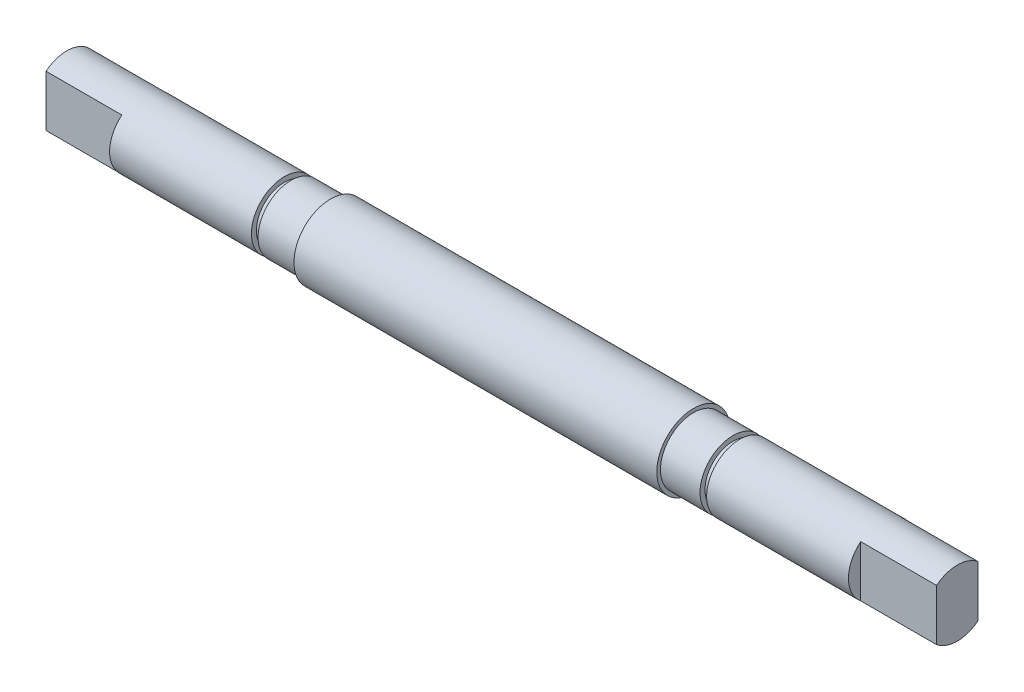
ISO-10303-21;
HEADER;
FILE_DESCRIPTION(('STEP AP214'),'2;1');
FILE_NAME('part.step','',(''),(''),'','','');
FILE_SCHEMA(('AUTOMOTIVE_DESIGN { 1 0 10303 214 1 1 1 1 }'));
ENDSEC;
DATA;
#1=APPLICATION_CONTEXT('core data for automotive mechanical design processes');
#2=APPLICATION_PROTOCOL_DEFINITION('international standard','automotive_design',2000,#1);
#3=PRODUCT_CONTEXT('',#1,'mechanical');
#4=PRODUCT('Part','Part','',(#3));
#5=PRODUCT_RELATED_PRODUCT_CATEGORY('part','',(#4));
#6=PRODUCT_DEFINITION_FORMATION('','',#4);
#7=PRODUCT_DEFINITION_CONTEXT('part definition',#1,'design');
#8=PRODUCT_DEFINITION('design','',#6,#7);
#9=PRODUCT_DEFINITION_SHAPE('','',#8);
#10=(LENGTH_UNIT() NAMED_UNIT(*) SI_UNIT(.MILLI.,.METRE.));
#11=(NAMED_UNIT(*) PLANE_ANGLE_UNIT() SI_UNIT($,.RADIAN.));
#12=(NAMED_UNIT(*) SI_UNIT($,.STERADIAN.) SOLID_ANGLE_UNIT());
#13=UNCERTAINTY_MEASURE_WITH_UNIT(LENGTH_MEASURE(1.E-05),#10,'distance_accuracy_value','');
#14=(GEOMETRIC_REPRESENTATION_CONTEXT(3) GLOBAL_UNCERTAINTY_ASSIGNED_CONTEXT((#13)) GLOBAL_UNIT_ASSIGNED_CONTEXT((#10,
#11,#12)) REPRESENTATION_CONTEXT('',''));
#15=CARTESIAN_POINT('',(0.,0.,0.));
#16=DIRECTION('',(0.,0.,1.));
#17=DIRECTION('',(1.,0.,0.));
#18=AXIS2_PLACEMENT_3D('',#15,#16,#17);
#19=CARTESIAN_POINT('',(203.505191192069,10.,0.));
#20=DIRECTION('',(1.,0.,0.));
#21=DIRECTION('',(0.,0.,1.));
#22=AXIS2_PLACEMENT_3D('',#19,#20,#21);
#23=PLANE('',#22);
#24=CARTESIAN_POINT('',(203.505191192069,0.,0.));
#25=DIRECTION('',(1.,0.,0.));
#26=DIRECTION('',(0.,0.,-1.));
#27=AXIS2_PLACEMENT_3D('',#24,#25,#26);
#28=CIRCLE('',#27,10.);
#29=CARTESIAN_POINT('',(203.505191192069,7.78345250416509,-6.27836500335925));
#30=VERTEX_POINT('',#29);
#31=CARTESIAN_POINT('',(203.505191192069,7.7834525041651,6.27836500335925));
#32=VERTEX_POINT('',#31);
#33=EDGE_CURVE('E142',#30,#32,#28,.T.);
#34=ORIENTED_EDGE('',*,*,#33,.T.);
#35=DIRECTION('',(0.,-1.,0.));
#36=VECTOR('',#35,1.);
#37=CARTESIAN_POINT('',(203.505191192069,-7.78345250416509,6.27836500335925));
#38=LINE('',#37,#36);
#39=CARTESIAN_POINT('',(203.505191192069,-7.78345250416509,6.27836500335925));
#40=VERTEX_POINT('',#39);
#41=EDGE_CURVE('E106',#32,#40,#38,.T.);
#42=ORIENTED_EDGE('',*,*,#41,.T.);
#43=CARTESIAN_POINT('',(203.505191192069,-7.7834525041651,-6.27836500335925));
#44=VERTEX_POINT('',#43);
#45=EDGE_CURVE('E111',#40,#44,#28,.T.);
#46=ORIENTED_EDGE('',*,*,#45,.T.);
#47=DIRECTION('',(0.,1.,0.));
#48=VECTOR('',#47,1.);
#49=CARTESIAN_POINT('',(203.505191192069,-7.7834525041651,-6.27836500335925));
#50=LINE('',#49,#48);
#51=EDGE_CURVE('E121',#44,#30,#50,.T.);
#52=ORIENTED_EDGE('',*,*,#51,.T.);
#53=EDGE_LOOP('',(#34,#42,#46,#52));
#54=FACE_BOUND('',#53,.T.);
#55=ADVANCED_FACE('F32',(#54),#23,.T.);
#56=CARTESIAN_POINT('',(66.5954170694878,0.,0.));
#57=DIRECTION('',(-1.,0.,0.));
#58=DIRECTION('',(0.,0.,-1.));
#59=AXIS2_PLACEMENT_3D('',#56,#57,#58);
#60=CYLINDRICAL_SURFACE('',#59,10.);
#61=CARTESIAN_POINT('',(137.505191192069,0.,0.));
#62=DIRECTION('',(1.,0.,0.));
#63=DIRECTION('',(0.,0.,-1.));
#64=AXIS2_PLACEMENT_3D('',#61,#62,#63);
#65=CIRCLE('',#64,10.);
#66=CARTESIAN_POINT('',(137.505191192069,0.,-10.));
#67=VERTEX_POINT('',#66);
#68=EDGE_CURVE('E139',#67,#67,#65,.T.);
#69=ORIENTED_EDGE('',*,*,#68,.T.);
#70=EDGE_LOOP('',(#69));
#71=FACE_BOUND('',#70,.T.);
#72=CARTESIAN_POINT('',(180.505191192069,0.,0.));
#73=DIRECTION('',(-1.,0.,0.));
#74=DIRECTION('',(0.,0.,1.));
#75=AXIS2_PLACEMENT_3D('',#72,#73,#74);
#76=CIRCLE('',#75,10.);
#77=CARTESIAN_POINT('',(180.505191192069,-7.78345250416509,6.27836500335925));
#78=VERTEX_POINT('',#77);
#79=CARTESIAN_POINT('',(180.505191192069,7.78345250416509,6.27836500335924));
#80=VERTEX_POINT('',#79);
#81=EDGE_CURVE('E102',#78,#80,#76,.T.);
#82=ORIENTED_EDGE('',*,*,#81,.T.);
#83=DIRECTION('',(1.,0.,0.));
#84=VECTOR('',#83,1.);
#85=CARTESIAN_POINT('',(180.505191192069,7.7834525041651,6.27836500335925));
#86=LINE('',#85,#84);
#87=EDGE_CURVE('E47',#80,#32,#86,.T.);
#88=ORIENTED_EDGE('',*,*,#87,.T.);
#89=ORIENTED_EDGE('',*,*,#33,.F.);
#90=DIRECTION('',(1.,0.,0.));
#91=VECTOR('',#90,1.);
#92=CARTESIAN_POINT('',(180.505191192069,7.78345250416509,-6.27836500335925));
#93=LINE('',#92,#91);
#94=CARTESIAN_POINT('',(180.505191192069,7.78345250416509,-6.27836500335925));
#95=VERTEX_POINT('',#94);
#96=EDGE_CURVE('E123',#95,#30,#93,.T.);
#97=ORIENTED_EDGE('',*,*,#96,.F.);
#98=CARTESIAN_POINT('',(180.505191192069,0.,0.));
#99=DIRECTION('',(-1.,0.,0.));
#100=DIRECTION('',(0.,0.,1.));
#101=AXIS2_PLACEMENT_3D('',#98,#99,#100);
#102=CIRCLE('',#101,10.);
#103=CARTESIAN_POINT('',(180.505191192069,-7.7834525041651,-6.27836500335925));
#104=VERTEX_POINT('',#103);
#105=EDGE_CURVE('E117',#95,#104,#102,.T.);
#106=ORIENTED_EDGE('',*,*,#105,.T.);
#107=DIRECTION('',(1.,0.,0.));
#108=VECTOR('',#107,1.);
#109=CARTESIAN_POINT('',(180.505191192069,-7.7834525041651,-6.27836500335925));
#110=LINE('',#109,#108);
#111=EDGE_CURVE('E55',#104,#44,#110,.T.);
#112=ORIENTED_EDGE('',*,*,#111,.T.);
#113=ORIENTED_EDGE('',*,*,#45,.F.);
#114=DIRECTION('',(1.,0.,0.));
#115=VECTOR('',#114,1.);
#116=CARTESIAN_POINT('',(180.505191192069,-7.78345250416509,6.27836500335925));
#117=LINE('',#116,#115);
#118=EDGE_CURVE('E98',#78,#40,#117,.T.);
#119=ORIENTED_EDGE('',*,*,#118,.F.);
#120=EDGE_LOOP('',(#82,#88,#89,#97,#106,#112,#113,#119));
#121=FACE_BOUND('',#120,.T.);
#122=ADVANCED_FACE('F109',(#71,#121),#60,.T.);
#123=CARTESIAN_POINT('',(13.5051911920693,11.1125,0.));
#124=DIRECTION('',(-1.,0.,0.));
#125=DIRECTION('',(0.,0.,1.));
#126=AXIS2_PLACEMENT_3D('',#123,#124,#125);
#127=PLANE('',#126);
#128=CARTESIAN_POINT('',(13.5051911920693,0.,0.));
#129=DIRECTION('',(1.,0.,0.));
#130=DIRECTION('',(0.,0.,-1.));
#131=AXIS2_PLACEMENT_3D('',#128,#129,#130);
#132=CIRCLE('',#131,10.);
#133=CARTESIAN_POINT('',(13.5051911920693,0.,-10.));
#134=VERTEX_POINT('',#133);
#135=EDGE_CURVE('E169',#134,#134,#132,.T.);
#136=ORIENTED_EDGE('',*,*,#135,.T.);
#137=EDGE_LOOP('',(#136));
#138=FACE_BOUND('',#137,.T.);
#139=CARTESIAN_POINT('',(13.5051911920693,0.,0.));
#140=DIRECTION('',(1.,0.,0.));
#141=DIRECTION('',(0.,0.,-1.));
#142=AXIS2_PLACEMENT_3D('',#139,#140,#141);
#143=CIRCLE('',#142,11.1125);
#144=CARTESIAN_POINT('',(13.5051911920693,0.,-11.1125));
#145=VERTEX_POINT('',#144);
#146=EDGE_CURVE('E11',#145,#145,#143,.T.);
#147=ORIENTED_EDGE('',*,*,#146,.F.);
#148=EDGE_LOOP('',(#147));
#149=FACE_BOUND('',#148,.T.);
#150=ADVANCED_FACE('F34',(#138,#149),#127,.T.);
#151=CARTESIAN_POINT('',(70.4149653146509,0.,0.));
#152=DIRECTION('',(1.,0.,0.));
#153=DIRECTION('',(0.,0.,-1.));
#154=AXIS2_PLACEMENT_3D('',#151,#152,#153);
#155=CYLINDRICAL_SURFACE('',#154,11.1125);
#156=ORIENTED_EDGE('',*,*,#146,.T.);
#157=EDGE_LOOP('',(#156));
#158=FACE_BOUND('',#157,.T.);
#159=CARTESIAN_POINT('',(123.505191192069,0.,0.));
#160=DIRECTION('',(1.,0.,0.));
#161=DIRECTION('',(0.,0.,-1.));
#162=AXIS2_PLACEMENT_3D('',#159,#160,#161);
#163=CIRCLE('',#162,11.1125);
#164=CARTESIAN_POINT('',(123.505191192069,0.,-11.1125));
#165=VERTEX_POINT('',#164);
#166=EDGE_CURVE('E145',#165,#165,#163,.T.);
#167=ORIENTED_EDGE('',*,*,#166,.F.);
#168=EDGE_LOOP('',(#167));
#169=FACE_BOUND('',#168,.T.);
#170=ADVANCED_FACE('F296',(#158,#169),#155,.T.);
#171=CARTESIAN_POINT('',(-66.4948088079307,10.,0.));
#172=DIRECTION('',(-1.,0.,0.));
#173=DIRECTION('',(0.,0.,1.));
#174=AXIS2_PLACEMENT_3D('',#171,#172,#173);
#175=PLANE('',#174);
#176=DIRECTION('',(0.,1.,0.));
#177=VECTOR('',#176,1.);
#178=CARTESIAN_POINT('',(-66.4948088079307,-7.7834525041651,-6.27836500335925));
#179=LINE('',#178,#177);
#180=CARTESIAN_POINT('',(-66.4948088079307,-7.7834525041651,-6.27836500335925));
#181=VERTEX_POINT('',#180);
#182=CARTESIAN_POINT('',(-66.4948088079307,7.78345250416509,-6.27836500335925));
#183=VERTEX_POINT('',#182);
#184=EDGE_CURVE('E148',#181,#183,#179,.T.);
#185=ORIENTED_EDGE('',*,*,#184,.F.);
#186=CARTESIAN_POINT('',(-66.4948088079307,0.,0.));
#187=DIRECTION('',(1.,0.,0.));
#188=DIRECTION('',(0.,0.,-1.));
#189=AXIS2_PLACEMENT_3D('',#186,#187,#188);
#190=CIRCLE('',#189,10.);
#191=CARTESIAN_POINT('',(-66.4948088079307,-7.78345250416509,6.27836500335925));
#192=VERTEX_POINT('',#191);
#193=EDGE_CURVE('E40',#192,#181,#190,.T.);
#194=ORIENTED_EDGE('',*,*,#193,.F.);
#195=DIRECTION('',(0.,-1.,0.));
#196=VECTOR('',#195,1.);
#197=CARTESIAN_POINT('',(-66.4948088079307,-7.78345250416509,6.27836500335925));
#198=LINE('',#197,#196);
#199=CARTESIAN_POINT('',(-66.4948088079307,7.7834525041651,6.27836500335925));
#200=VERTEX_POINT('',#199);
#201=EDGE_CURVE('E158',#200,#192,#198,.T.);
#202=ORIENTED_EDGE('',*,*,#201,.F.);
#203=EDGE_CURVE('E185',#183,#200,#190,.T.);
#204=ORIENTED_EDGE('',*,*,#203,.F.);
#205=EDGE_LOOP('',(#185,#194,#202,#204));
#206=FACE_BOUND('',#205,.T.);
#207=ADVANCED_FACE('F204',(#206),#175,.T.);
#208=CARTESIAN_POINT('',(70.4149653146509,0.,0.));
#209=DIRECTION('',(1.,0.,0.));
#210=DIRECTION('',(0.,0.,-1.));
#211=AXIS2_PLACEMENT_3D('',#208,#209,#210);
#212=CYLINDRICAL_SURFACE('',#211,10.);
#213=DIRECTION('',(-1.,0.,0.));
#214=VECTOR('',#213,1.);
#215=CARTESIAN_POINT('',(-43.4948088079307,-7.7834525041651,-6.27836500335925));
#216=LINE('',#215,#214);
#217=CARTESIAN_POINT('',(-43.4948088079307,-7.7834525041651,-6.27836500335925));
#218=VERTEX_POINT('',#217);
#219=EDGE_CURVE('E153',#218,#181,#216,.T.);
#220=ORIENTED_EDGE('',*,*,#219,.F.);
#221=CARTESIAN_POINT('',(-43.4948088079307,0.,0.));
#222=DIRECTION('',(-1.,0.,0.));
#223=DIRECTION('',(0.,0.,1.));
#224=AXIS2_PLACEMENT_3D('',#221,#222,#223);
#225=CIRCLE('',#224,10.);
#226=CARTESIAN_POINT('',(-43.4948088079307,7.78345250416509,-6.27836500335924));
#227=VERTEX_POINT('',#226);
#228=EDGE_CURVE('E149',#227,#218,#225,.T.);
#229=ORIENTED_EDGE('',*,*,#228,.F.);
#230=DIRECTION('',(-1.,0.,0.));
#231=VECTOR('',#230,1.);
#232=CARTESIAN_POINT('',(-43.4948088079307,7.78345250416509,-6.27836500335925));
#233=LINE('',#232,#231);
#234=EDGE_CURVE('E155',#227,#183,#233,.T.);
#235=ORIENTED_EDGE('',*,*,#234,.T.);
#236=ORIENTED_EDGE('',*,*,#203,.T.);
#237=DIRECTION('',(-1.,0.,0.));
#238=VECTOR('',#237,1.);
#239=CARTESIAN_POINT('',(-43.4948088079307,7.7834525041651,6.27836500335925));
#240=LINE('',#239,#238);
#241=CARTESIAN_POINT('',(-43.4948088079307,7.7834525041651,6.27836500335925));
#242=VERTEX_POINT('',#241);
#243=EDGE_CURVE('E164',#242,#200,#240,.T.);
#244=ORIENTED_EDGE('',*,*,#243,.F.);
#245=CARTESIAN_POINT('',(-43.4948088079307,0.,0.));
#246=DIRECTION('',(-1.,0.,0.));
#247=DIRECTION('',(0.,0.,1.));
#248=AXIS2_PLACEMENT_3D('',#245,#246,#247);
#249=CIRCLE('',#248,10.);
#250=CARTESIAN_POINT('',(-43.4948088079307,-7.7834525041651,6.27836500335925));
#251=VERTEX_POINT('',#250);
#252=EDGE_CURVE('E160',#251,#242,#249,.T.);
#253=ORIENTED_EDGE('',*,*,#252,.F.);
#254=DIRECTION('',(-1.,0.,0.));
#255=VECTOR('',#254,1.);
#256=CARTESIAN_POINT('',(-43.4948088079307,-7.78345250416509,6.27836500335925));
#257=LINE('',#256,#255);
#258=EDGE_CURVE('E166',#251,#192,#257,.T.);
#259=ORIENTED_EDGE('',*,*,#258,.T.);
#260=ORIENTED_EDGE('',*,*,#193,.T.);
#261=EDGE_LOOP('',(#220,#229,#235,#236,#244,#253,#259,#260));
#262=FACE_BOUND('',#261,.T.);
#263=CARTESIAN_POINT('',(-0.49480880793068,0.,0.));
#264=DIRECTION('',(1.,0.,0.));
#265=DIRECTION('',(0.,0.,-1.));
#266=AXIS2_PLACEMENT_3D('',#263,#264,#265);
#267=CIRCLE('',#266,10.);
#268=CARTESIAN_POINT('',(-0.49480880793068,0.,-10.));
#269=VERTEX_POINT('',#268);
#270=EDGE_CURVE('E183',#269,#269,#267,.T.);
#271=ORIENTED_EDGE('',*,*,#270,.F.);
#272=EDGE_LOOP('',(#271));
#273=FACE_BOUND('',#272,.T.);
#274=ADVANCED_FACE('F192',(#262,#273),#212,.T.);
#275=CARTESIAN_POINT('',(-0.494808807930674,10.,0.));
#276=DIRECTION('',(1.,0.,0.));
#277=DIRECTION('',(0.,0.,-1.));
#278=AXIS2_PLACEMENT_3D('',#275,#276,#277);
#279=PLANE('',#278);
#280=ORIENTED_EDGE('',*,*,#270,.T.);
#281=EDGE_LOOP('',(#280));
#282=FACE_BOUND('',#281,.T.);
#283=CARTESIAN_POINT('',(-0.49480880793068,0.,0.));
#284=DIRECTION('',(1.,0.,0.));
#285=DIRECTION('',(0.,0.,-1.));
#286=AXIS2_PLACEMENT_3D('',#283,#284,#285);
#287=CIRCLE('',#286,8.49999999999999);
#288=CARTESIAN_POINT('',(-0.49480880793068,0.,-8.49999999999999));
#289=VERTEX_POINT('',#288);
#290=EDGE_CURVE('E180',#289,#289,#287,.T.);
#291=ORIENTED_EDGE('',*,*,#290,.F.);
#292=EDGE_LOOP('',(#291));
#293=FACE_BOUND('',#292,.T.);
#294=ADVANCED_FACE('F351',(#282,#293),#279,.T.);
#295=CARTESIAN_POINT('',(70.4149653146509,0.,0.));
#296=DIRECTION('',(1.,0.,0.));
#297=DIRECTION('',(0.,0.,-1.));
#298=AXIS2_PLACEMENT_3D('',#295,#296,#297);
#299=CYLINDRICAL_SURFACE('',#298,8.49999999999999);
#300=ORIENTED_EDGE('',*,*,#290,.T.);
#301=EDGE_LOOP('',(#300));
#302=FACE_BOUND('',#301,.T.);
#303=CARTESIAN_POINT('',(1.50519119206932,0.,0.));
#304=DIRECTION('',(1.,0.,0.));
#305=DIRECTION('',(0.,0.,-1.));
#306=AXIS2_PLACEMENT_3D('',#303,#304,#305);
#307=CIRCLE('',#306,8.49999999999999);
#308=CARTESIAN_POINT('',(1.50519119206932,0.,-8.49999999999999));
#309=VERTEX_POINT('',#308);
#310=EDGE_CURVE('E177',#309,#309,#307,.T.);
#311=ORIENTED_EDGE('',*,*,#310,.F.);
#312=EDGE_LOOP('',(#311));
#313=FACE_BOUND('',#312,.T.);
#314=ADVANCED_FACE('F377',(#302,#313),#299,.T.);
#315=CARTESIAN_POINT('',(1.50519119206933,10.,0.));
#316=DIRECTION('',(-1.,0.,0.));
#317=DIRECTION('',(0.,0.,1.));
#318=AXIS2_PLACEMENT_3D('',#315,#316,#317);
#319=PLANE('',#318);
#320=ORIENTED_EDGE('',*,*,#310,.T.);
#321=EDGE_LOOP('',(#320));
#322=FACE_BOUND('',#321,.T.);
#323=CARTESIAN_POINT('',(1.50519119206932,0.,0.));
#324=DIRECTION('',(1.,0.,0.));
#325=DIRECTION('',(0.,0.,-1.));
#326=AXIS2_PLACEMENT_3D('',#323,#324,#325);
#327=CIRCLE('',#326,10.);
#328=CARTESIAN_POINT('',(1.50519119206932,0.,-10.));
#329=VERTEX_POINT('',#328);
#330=EDGE_CURVE('E174',#329,#329,#327,.T.);
#331=ORIENTED_EDGE('',*,*,#330,.F.);
#332=EDGE_LOOP('',(#331));
#333=FACE_BOUND('',#332,.T.);
#334=ADVANCED_FACE('F367',(#322,#333),#319,.T.);
#335=CARTESIAN_POINT('',(70.4149653146509,0.,0.));
#336=DIRECTION('',(1.,0.,0.));
#337=DIRECTION('',(0.,0.,-1.));
#338=AXIS2_PLACEMENT_3D('',#335,#336,#337);
#339=CYLINDRICAL_SURFACE('',#338,10.);
#340=ORIENTED_EDGE('',*,*,#330,.T.);
#341=EDGE_LOOP('',(#340));
#342=FACE_BOUND('',#341,.T.);
#343=ORIENTED_EDGE('',*,*,#135,.F.);
#344=EDGE_LOOP('',(#343));
#345=FACE_BOUND('',#344,.T.);
#346=ADVANCED_FACE('F340',(#342,#345),#339,.T.);
#347=CARTESIAN_POINT('',(-43.4948088079307,-7.78345250416509,6.27836500335925));
#348=DIRECTION('',(0.,0.,-1.));
#349=DIRECTION('',(-1.,0.,0.));
#350=AXIS2_PLACEMENT_3D('',#347,#348,#349);
#351=PLANE('',#350);
#352=ORIENTED_EDGE('',*,*,#201,.T.);
#353=ORIENTED_EDGE('',*,*,#258,.F.);
#354=DIRECTION('',(0.,-1.,0.));
#355=VECTOR('',#354,1.);
#356=CARTESIAN_POINT('',(-43.4948088079307,-7.78345250416509,6.27836500335925));
#357=LINE('',#356,#355);
#358=EDGE_CURVE('E162',#242,#251,#357,.T.);
#359=ORIENTED_EDGE('',*,*,#358,.F.);
#360=ORIENTED_EDGE('',*,*,#243,.T.);
#361=EDGE_LOOP('',(#352,#353,#359,#360));
#362=FACE_BOUND('',#361,.T.);
#363=ADVANCED_FACE('F202',(#362),#351,.F.);
#364=CARTESIAN_POINT('',(-43.4948088079307,0.,0.));
#365=DIRECTION('',(-1.,0.,0.));
#366=DIRECTION('',(0.,0.,1.));
#367=AXIS2_PLACEMENT_3D('',#364,#365,#366);
#368=PLANE('',#367);
#369=ORIENTED_EDGE('',*,*,#252,.T.);
#370=ORIENTED_EDGE('',*,*,#358,.T.);
#371=EDGE_LOOP('',(#369,#370));
#372=FACE_BOUND('',#371,.T.);
#373=ADVANCED_FACE('F220',(#372),#368,.T.);
#374=CARTESIAN_POINT('',(-43.4948088079307,-7.7834525041651,-6.27836500335925));
#375=DIRECTION('',(0.,0.,1.));
#376=DIRECTION('',(1.,0.,0.));
#377=AXIS2_PLACEMENT_3D('',#374,#375,#376);
#378=PLANE('',#377);
#379=ORIENTED_EDGE('',*,*,#184,.T.);
#380=ORIENTED_EDGE('',*,*,#234,.F.);
#381=DIRECTION('',(0.,1.,0.));
#382=VECTOR('',#381,1.);
#383=CARTESIAN_POINT('',(-43.4948088079307,-7.7834525041651,-6.27836500335925));
#384=LINE('',#383,#382);
#385=EDGE_CURVE('E151',#218,#227,#384,.T.);
#386=ORIENTED_EDGE('',*,*,#385,.F.);
#387=ORIENTED_EDGE('',*,*,#219,.T.);
#388=EDGE_LOOP('',(#379,#380,#386,#387));
#389=FACE_BOUND('',#388,.T.);
#390=ADVANCED_FACE('F206',(#389),#378,.F.);
#391=CARTESIAN_POINT('',(-43.4948088079307,0.,0.));
#392=DIRECTION('',(-1.,0.,0.));
#393=DIRECTION('',(0.,0.,1.));
#394=AXIS2_PLACEMENT_3D('',#391,#392,#393);
#395=PLANE('',#394);
#396=ORIENTED_EDGE('',*,*,#228,.T.);
#397=ORIENTED_EDGE('',*,*,#385,.T.);
#398=EDGE_LOOP('',(#396,#397));
#399=FACE_BOUND('',#398,.T.);
#400=ADVANCED_FACE('F209',(#399),#395,.T.);
#401=CARTESIAN_POINT('',(123.505191192069,11.1125,0.));
#402=DIRECTION('',(1.,0.,0.));
#403=DIRECTION('',(0.,0.,1.));
#404=AXIS2_PLACEMENT_3D('',#401,#402,#403);
#405=PLANE('',#404);
#406=CARTESIAN_POINT('',(123.505191192069,0.,0.));
#407=DIRECTION('',(1.,0.,0.));
#408=DIRECTION('',(0.,0.,-1.));
#409=AXIS2_PLACEMENT_3D('',#406,#407,#408);
#410=CIRCLE('',#409,10.);
#411=CARTESIAN_POINT('',(123.505191192069,0.,-10.));
#412=VERTEX_POINT('',#411);
#413=EDGE_CURVE('E113',#412,#412,#410,.T.);
#414=ORIENTED_EDGE('',*,*,#413,.F.);
#415=EDGE_LOOP('',(#414));
#416=FACE_BOUND('',#415,.T.);
#417=ORIENTED_EDGE('',*,*,#166,.T.);
#418=EDGE_LOOP('',(#417));
#419=FACE_BOUND('',#418,.T.);
#420=ADVANCED_FACE('F211',(#416,#419),#405,.T.);
#421=CARTESIAN_POINT('',(137.505191192069,10.,0.));
#422=DIRECTION('',(-1.,0.,0.));
#423=DIRECTION('',(0.,0.,-1.));
#424=AXIS2_PLACEMENT_3D('',#421,#422,#423);
#425=PLANE('',#424);
#426=ORIENTED_EDGE('',*,*,#68,.F.);
#427=EDGE_LOOP('',(#426));
#428=FACE_BOUND('',#427,.T.);
#429=CARTESIAN_POINT('',(137.505191192069,0.,0.));
#430=DIRECTION('',(1.,0.,0.));
#431=DIRECTION('',(0.,0.,-1.));
#432=AXIS2_PLACEMENT_3D('',#429,#430,#431);
#433=CIRCLE('',#432,8.49999999999999);
#434=CARTESIAN_POINT('',(137.505191192069,0.,-8.49999999999999));
#435=VERTEX_POINT('',#434);
#436=EDGE_CURVE('E136',#435,#435,#433,.T.);
#437=ORIENTED_EDGE('',*,*,#436,.T.);
#438=EDGE_LOOP('',(#437));
#439=FACE_BOUND('',#438,.T.);
#440=ADVANCED_FACE('F217',(#428,#439),#425,.T.);
#441=CARTESIAN_POINT('',(66.5954170694878,0.,0.));
#442=DIRECTION('',(-1.,0.,0.));
#443=DIRECTION('',(0.,0.,-1.));
#444=AXIS2_PLACEMENT_3D('',#441,#442,#443);
#445=CYLINDRICAL_SURFACE('',#444,8.49999999999999);
#446=ORIENTED_EDGE('',*,*,#436,.F.);
#447=EDGE_LOOP('',(#446));
#448=FACE_BOUND('',#447,.T.);
#449=CARTESIAN_POINT('',(135.505191192069,0.,0.));
#450=DIRECTION('',(1.,0.,0.));
#451=DIRECTION('',(0.,0.,-1.));
#452=AXIS2_PLACEMENT_3D('',#449,#450,#451);
#453=CIRCLE('',#452,8.49999999999999);
#454=CARTESIAN_POINT('',(135.505191192069,0.,-8.49999999999999));
#455=VERTEX_POINT('',#454);
#456=EDGE_CURVE('E133',#455,#455,#453,.T.);
#457=ORIENTED_EDGE('',*,*,#456,.T.);
#458=EDGE_LOOP('',(#457));
#459=FACE_BOUND('',#458,.T.);
#460=ADVANCED_FACE('F233',(#448,#459),#445,.T.);
#461=CARTESIAN_POINT('',(135.505191192069,10.,0.));
#462=DIRECTION('',(1.,0.,0.));
#463=DIRECTION('',(0.,0.,1.));
#464=AXIS2_PLACEMENT_3D('',#461,#462,#463);
#465=PLANE('',#464);
#466=ORIENTED_EDGE('',*,*,#456,.F.);
#467=EDGE_LOOP('',(#466));
#468=FACE_BOUND('',#467,.T.);
#469=CARTESIAN_POINT('',(135.505191192069,0.,0.));
#470=DIRECTION('',(1.,0.,0.));
#471=DIRECTION('',(0.,0.,-1.));
#472=AXIS2_PLACEMENT_3D('',#469,#470,#471);
#473=CIRCLE('',#472,10.);
#474=CARTESIAN_POINT('',(135.505191192069,0.,-10.));
#475=VERTEX_POINT('',#474);
#476=EDGE_CURVE('E130',#475,#475,#473,.T.);
#477=ORIENTED_EDGE('',*,*,#476,.T.);
#478=EDGE_LOOP('',(#477));
#479=FACE_BOUND('',#478,.T.);
#480=ADVANCED_FACE('F237',(#468,#479),#465,.T.);
#481=CARTESIAN_POINT('',(66.5954170694878,0.,0.));
#482=DIRECTION('',(-1.,0.,0.));
#483=DIRECTION('',(0.,0.,-1.));
#484=AXIS2_PLACEMENT_3D('',#481,#482,#483);
#485=CYLINDRICAL_SURFACE('',#484,10.);
#486=ORIENTED_EDGE('',*,*,#476,.F.);
#487=EDGE_LOOP('',(#486));
#488=FACE_BOUND('',#487,.T.);
#489=ORIENTED_EDGE('',*,*,#413,.T.);
#490=EDGE_LOOP('',(#489));
#491=FACE_BOUND('',#490,.T.);
#492=ADVANCED_FACE('F241',(#488,#491),#485,.T.);
#493=CARTESIAN_POINT('',(180.505191192069,-7.7834525041651,-6.27836500335925));
#494=DIRECTION('',(0.,0.,-1.));
#495=DIRECTION('',(-1.,0.,0.));
#496=AXIS2_PLACEMENT_3D('',#493,#494,#495);
#497=PLANE('',#496);
#498=ORIENTED_EDGE('',*,*,#51,.F.);
#499=ORIENTED_EDGE('',*,*,#111,.F.);
#500=DIRECTION('',(0.,1.,0.));
#501=VECTOR('',#500,1.);
#502=CARTESIAN_POINT('',(180.505191192069,-7.7834525041651,-6.27836500335925));
#503=LINE('',#502,#501);
#504=EDGE_CURVE('E120',#104,#95,#503,.T.);
#505=ORIENTED_EDGE('',*,*,#504,.T.);
#506=ORIENTED_EDGE('',*,*,#96,.T.);
#507=EDGE_LOOP('',(#498,#499,#505,#506));
#508=FACE_BOUND('',#507,.T.);
#509=ADVANCED_FACE('F245',(#508),#497,.T.);
#510=CARTESIAN_POINT('',(180.505191192069,0.,0.));
#511=DIRECTION('',(1.,0.,0.));
#512=DIRECTION('',(0.,0.,1.));
#513=AXIS2_PLACEMENT_3D('',#510,#511,#512);
#514=PLANE('',#513);
#515=ORIENTED_EDGE('',*,*,#105,.F.);
#516=ORIENTED_EDGE('',*,*,#504,.F.);
#517=EDGE_LOOP('',(#515,#516));
#518=FACE_BOUND('',#517,.T.);
#519=ADVANCED_FACE('F249',(#518),#514,.T.);
#520=CARTESIAN_POINT('',(180.505191192069,-7.78345250416509,6.27836500335925));
#521=DIRECTION('',(0.,0.,1.));
#522=DIRECTION('',(1.,0.,0.));
#523=AXIS2_PLACEMENT_3D('',#520,#521,#522);
#524=PLANE('',#523);
#525=ORIENTED_EDGE('',*,*,#41,.F.);
#526=ORIENTED_EDGE('',*,*,#87,.F.);
#527=DIRECTION('',(0.,-1.,0.));
#528=VECTOR('',#527,1.);
#529=CARTESIAN_POINT('',(180.505191192069,-7.78345250416509,6.27836500335925));
#530=LINE('',#529,#528);
#531=EDGE_CURVE('E94',#80,#78,#530,.T.);
#532=ORIENTED_EDGE('',*,*,#531,.T.);
#533=ORIENTED_EDGE('',*,*,#118,.T.);
#534=EDGE_LOOP('',(#525,#526,#532,#533));
#535=FACE_BOUND('',#534,.T.);
#536=ADVANCED_FACE('F96',(#535),#524,.T.);
#537=CARTESIAN_POINT('',(180.505191192069,0.,0.));
#538=DIRECTION('',(1.,0.,0.));
#539=DIRECTION('',(0.,0.,1.));
#540=AXIS2_PLACEMENT_3D('',#537,#538,#539);
#541=PLANE('',#540);
#542=ORIENTED_EDGE('',*,*,#81,.F.);
#543=ORIENTED_EDGE('',*,*,#531,.F.);
#544=EDGE_LOOP('',(#542,#543));
#545=FACE_BOUND('',#544,.T.);
#546=ADVANCED_FACE('F104',(#545),#541,.T.);
#547=CLOSED_SHELL('',(#55,#122,#150,#170,#207,#274,#294,#314,#334,#346,#363,#373,#390,#400,#420,
#440,#460,#480,#492,#509,#519,#536,#546));
#548=MANIFOLD_SOLID_BREP('B2',#547);
#549=ADVANCED_BREP_SHAPE_REPRESENTATION('',(#18,#548),#14);
#550=SHAPE_DEFINITION_REPRESENTATION(#9,#549);
ENDSEC;
END-ISO-10303-21;
